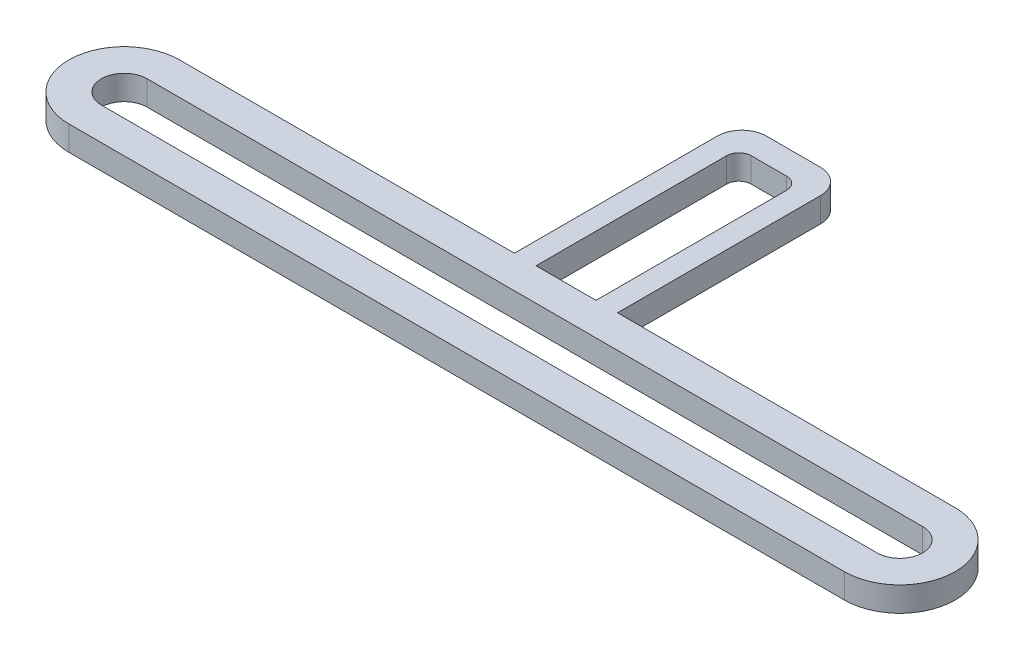
ISO-10303-21;
HEADER;
FILE_DESCRIPTION(('STEP AP214'),'2;1');
FILE_NAME('part.step','',(''),(''),'','','');
FILE_SCHEMA(('AUTOMOTIVE_DESIGN { 1 0 10303 214 1 1 1 1 }'));
ENDSEC;
DATA;
#1=APPLICATION_CONTEXT('core data for automotive mechanical design processes');
#2=APPLICATION_PROTOCOL_DEFINITION('international standard','automotive_design',2000,#1);
#3=PRODUCT_CONTEXT('',#1,'mechanical');
#4=PRODUCT('Part','Part','',(#3));
#5=PRODUCT_RELATED_PRODUCT_CATEGORY('part','',(#4));
#6=PRODUCT_DEFINITION_FORMATION('','',#4);
#7=PRODUCT_DEFINITION_CONTEXT('part definition',#1,'design');
#8=PRODUCT_DEFINITION('design','',#6,#7);
#9=PRODUCT_DEFINITION_SHAPE('','',#8);
#10=(LENGTH_UNIT() NAMED_UNIT(*) SI_UNIT(.MILLI.,.METRE.));
#11=(NAMED_UNIT(*) PLANE_ANGLE_UNIT() SI_UNIT($,.RADIAN.));
#12=(NAMED_UNIT(*) SI_UNIT($,.STERADIAN.) SOLID_ANGLE_UNIT());
#13=UNCERTAINTY_MEASURE_WITH_UNIT(LENGTH_MEASURE(1.E-05),#10,'distance_accuracy_value','');
#14=(GEOMETRIC_REPRESENTATION_CONTEXT(3) GLOBAL_UNCERTAINTY_ASSIGNED_CONTEXT((#13)) GLOBAL_UNIT_ASSIGNED_CONTEXT((#10,
#11,#12)) REPRESENTATION_CONTEXT('',''));
#15=CARTESIAN_POINT('',(0.,0.,0.));
#16=DIRECTION('',(0.,0.,1.));
#17=DIRECTION('',(1.,0.,0.));
#18=AXIS2_PLACEMENT_3D('',#15,#16,#17);
#19=CARTESIAN_POINT('',(-40.0346451989385,1.27,-0.00503280596550969));
#20=DIRECTION('',(0.,1.,0.));
#21=DIRECTION('',(0.,0.,1.));
#22=AXIS2_PLACEMENT_3D('',#19,#20,#21);
#23=PLANE('',#22);
#24=CARTESIAN_POINT('',(-40.0346451989385,1.27,-0.00503280596550969));
#25=DIRECTION('',(0.,1.,0.));
#26=DIRECTION('',(0.,0.,1.));
#27=AXIS2_PLACEMENT_3D('',#24,#25,#26);
#28=CIRCLE('',#27,5.7185550593657);
#29=CARTESIAN_POINT('',(-40.0346451989385,1.27,-5.72358786533121));
#30=VERTEX_POINT('',#29);
#31=CARTESIAN_POINT('',(-40.0346451989385,1.27,5.71352225340019));
#32=VERTEX_POINT('',#31);
#33=EDGE_CURVE('E387',#30,#32,#28,.T.);
#34=ORIENTED_EDGE('',*,*,#33,.T.);
#35=DIRECTION('',(1.,0.,0.));
#36=VECTOR('',#35,1.);
#37=CARTESIAN_POINT('',(-40.0346451989385,1.27,5.71352225340019));
#38=LINE('',#37,#36);
#39=CARTESIAN_POINT('',(40.0232445285439,1.27,5.71352225340019));
#40=VERTEX_POINT('',#39);
#41=EDGE_CURVE('E388',#32,#40,#38,.T.);
#42=ORIENTED_EDGE('',*,*,#41,.T.);
#43=CARTESIAN_POINT('',(40.0232445285439,1.27,-0.00503280596550969));
#44=DIRECTION('',(0.,1.,0.));
#45=DIRECTION('',(0.,0.,1.));
#46=AXIS2_PLACEMENT_3D('',#43,#44,#45);
#47=CIRCLE('',#46,5.7185550593657);
#48=CARTESIAN_POINT('',(40.0232445285439,1.27,-5.72358786533121));
#49=VERTEX_POINT('',#48);
#50=EDGE_CURVE('E395',#40,#49,#47,.T.);
#51=ORIENTED_EDGE('',*,*,#50,.T.);
#52=DIRECTION('',(1.,0.,0.));
#53=VECTOR('',#52,1.);
#54=CARTESIAN_POINT('',(5.17161553807814,1.27,-5.72358786533121));
#55=LINE('',#54,#53);
#56=CARTESIAN_POINT('',(5.17161553807814,1.27,-5.72358786533121));
#57=VERTEX_POINT('',#56);
#58=EDGE_CURVE('E396',#57,#49,#55,.T.);
#59=ORIENTED_EDGE('',*,*,#58,.F.);
#60=DIRECTION('',(0.,0.,-1.));
#61=VECTOR('',#60,1.);
#62=CARTESIAN_POINT('',(5.17161553807814,1.27,-5.72358786533121));
#63=LINE('',#62,#61);
#64=CARTESIAN_POINT('',(5.17161553807815,1.27,-26.6618558266479));
#65=VERTEX_POINT('',#64);
#66=EDGE_CURVE('E402',#57,#65,#63,.T.);
#67=ORIENTED_EDGE('',*,*,#66,.T.);
#68=CARTESIAN_POINT('',(2.63161553807814,1.27,-26.6618558266479));
#69=DIRECTION('',(0.,-1.,0.));
#70=DIRECTION('',(0.,0.,-1.));
#71=AXIS2_PLACEMENT_3D('',#68,#69,#70);
#72=CIRCLE('',#71,2.54000000000001);
#73=CARTESIAN_POINT('',(2.63161553807814,1.27,-29.201855826648));
#74=VERTEX_POINT('',#73);
#75=EDGE_CURVE('E404',#74,#65,#72,.T.);
#76=ORIENTED_EDGE('',*,*,#75,.F.);
#77=DIRECTION('',(1.,0.,0.));
#78=VECTOR('',#77,1.);
#79=CARTESIAN_POINT('',(-2.9368882764058,1.27,-29.201855826648));
#80=LINE('',#79,#78);
#81=CARTESIAN_POINT('',(-2.9368882764058,1.27,-29.201855826648));
#82=VERTEX_POINT('',#81);
#83=EDGE_CURVE('E407',#82,#74,#80,.T.);
#84=ORIENTED_EDGE('',*,*,#83,.F.);
#85=CARTESIAN_POINT('',(-2.9368882764058,1.27,-26.6618558266479));
#86=DIRECTION('',(0.,1.,0.));
#87=DIRECTION('',(0.,0.,1.));
#88=AXIS2_PLACEMENT_3D('',#85,#86,#87);
#89=CIRCLE('',#88,2.54000000000001);
#90=CARTESIAN_POINT('',(-5.47688827640581,1.27,-26.6618558266479));
#91=VERTEX_POINT('',#90);
#92=EDGE_CURVE('E411',#82,#91,#89,.T.);
#93=ORIENTED_EDGE('',*,*,#92,.T.);
#94=DIRECTION('',(0.,0.,-1.));
#95=VECTOR('',#94,1.);
#96=CARTESIAN_POINT('',(-5.47688827640581,1.27,-5.72358786533121));
#97=LINE('',#96,#95);
#98=CARTESIAN_POINT('',(-5.47688827640581,1.27,-5.72358786533121));
#99=VERTEX_POINT('',#98);
#100=EDGE_CURVE('E412',#99,#91,#97,.T.);
#101=ORIENTED_EDGE('',*,*,#100,.F.);
#102=DIRECTION('',(1.,0.,0.));
#103=VECTOR('',#102,1.);
#104=CARTESIAN_POINT('',(-40.0346451989385,1.27,-5.72358786533121));
#105=LINE('',#104,#103);
#106=EDGE_CURVE('E420',#30,#99,#105,.T.);
#107=ORIENTED_EDGE('',*,*,#106,.F.);
#108=EDGE_LOOP('',(#34,#42,#51,#59,#67,#76,#84,#93,#101,#107));
#109=FACE_BOUND('',#108,.T.);
#110=DIRECTION('',(0.,0.,-1.));
#111=VECTOR('',#110,1.);
#112=CARTESIAN_POINT('',(2.94644782536895,1.27,-5.72358786533121));
#113=LINE('',#112,#111);
#114=CARTESIAN_POINT('',(2.94644782536895,1.27,-5.72358786533121));
#115=VERTEX_POINT('',#114);
#116=CARTESIAN_POINT('',(2.94644782536895,1.27,-25.3918558266479));
#117=VERTEX_POINT('',#116);
#118=EDGE_CURVE('E323',#115,#117,#113,.T.);
#119=ORIENTED_EDGE('',*,*,#118,.F.);
#120=DIRECTION('',(1.,0.,0.));
#121=VECTOR('',#120,1.);
#122=CARTESIAN_POINT('',(-3.23867048751246,1.27,-5.72358786533121));
#123=LINE('',#122,#121);
#124=CARTESIAN_POINT('',(-3.23867048751246,1.27,-5.72358786533121));
#125=VERTEX_POINT('',#124);
#126=EDGE_CURVE('E319',#125,#115,#123,.T.);
#127=ORIENTED_EDGE('',*,*,#126,.F.);
#128=DIRECTION('',(0.,0.,-1.));
#129=VECTOR('',#128,1.);
#130=CARTESIAN_POINT('',(-3.23867048751246,1.27,-5.72358786533121));
#131=LINE('',#130,#129);
#132=CARTESIAN_POINT('',(-3.23867048751246,1.27,-25.3918558266479));
#133=VERTEX_POINT('',#132);
#134=EDGE_CURVE('E340',#125,#133,#131,.T.);
#135=ORIENTED_EDGE('',*,*,#134,.T.);
#136=CARTESIAN_POINT('',(-1.96867048751246,1.27,-25.3918558266479));
#137=DIRECTION('',(0.,1.,0.));
#138=DIRECTION('',(0.,0.,1.));
#139=AXIS2_PLACEMENT_3D('',#136,#137,#138);
#140=CIRCLE('',#139,1.27);
#141=CARTESIAN_POINT('',(-1.96867048751246,1.27,-26.6618558266479));
#142=VERTEX_POINT('',#141);
#143=EDGE_CURVE('E333',#142,#133,#140,.T.);
#144=ORIENTED_EDGE('',*,*,#143,.F.);
#145=DIRECTION('',(1.,0.,0.));
#146=VECTOR('',#145,1.);
#147=CARTESIAN_POINT('',(-1.96867048751246,1.27,-26.6618558266479));
#148=LINE('',#147,#146);
#149=CARTESIAN_POINT('',(1.67644782536895,1.27,-26.6618558266479));
#150=VERTEX_POINT('',#149);
#151=EDGE_CURVE('E332',#142,#150,#148,.T.);
#152=ORIENTED_EDGE('',*,*,#151,.T.);
#153=CARTESIAN_POINT('',(1.67644782536895,1.27,-25.3918558266479));
#154=DIRECTION('',(0.,-1.,0.));
#155=DIRECTION('',(0.,0.,-1.));
#156=AXIS2_PLACEMENT_3D('',#153,#154,#155);
#157=CIRCLE('',#156,1.27);
#158=EDGE_CURVE('E330',#150,#117,#157,.T.);
#159=ORIENTED_EDGE('',*,*,#158,.T.);
#160=EDGE_LOOP('',(#119,#127,#135,#144,#152,#159));
#161=FACE_BOUND('',#160,.T.);
#162=DIRECTION('',(1.,0.,0.));
#163=VECTOR('',#162,1.);
#164=CARTESIAN_POINT('',(-40.0346451989385,1.27,2.35261708693085));
#165=LINE('',#164,#163);
#166=CARTESIAN_POINT('',(-40.0346451989385,1.27,2.35261708693085));
#167=VERTEX_POINT('',#166);
#168=CARTESIAN_POINT('',(40.0232445285439,1.27,2.35261708693085));
#169=VERTEX_POINT('',#168);
#170=EDGE_CURVE('E284',#167,#169,#165,.T.);
#171=ORIENTED_EDGE('',*,*,#170,.F.);
#172=CARTESIAN_POINT('',(-40.0346451989385,1.27,-0.00503280596550969));
#173=DIRECTION('',(0.,1.,0.));
#174=DIRECTION('',(0.,0.,1.));
#175=AXIS2_PLACEMENT_3D('',#172,#173,#174);
#176=CIRCLE('',#175,2.35764989289636);
#177=CARTESIAN_POINT('',(-40.0346451989385,1.27,-2.36268269886187));
#178=VERTEX_POINT('',#177);
#179=EDGE_CURVE('E272',#178,#167,#176,.T.);
#180=ORIENTED_EDGE('',*,*,#179,.F.);
#181=DIRECTION('',(1.,0.,0.));
#182=VECTOR('',#181,1.);
#183=CARTESIAN_POINT('',(-40.0346451989385,1.27,-2.36268269886187));
#184=LINE('',#183,#182);
#185=CARTESIAN_POINT('',(40.0232445285439,1.27,-2.36268269886187));
#186=VERTEX_POINT('',#185);
#187=EDGE_CURVE('E300',#178,#186,#184,.T.);
#188=ORIENTED_EDGE('',*,*,#187,.T.);
#189=CARTESIAN_POINT('',(40.0232445285439,1.27,-0.00503280596550969));
#190=DIRECTION('',(0.,1.,0.));
#191=DIRECTION('',(0.,0.,1.));
#192=AXIS2_PLACEMENT_3D('',#189,#190,#191);
#193=CIRCLE('',#192,2.35764989289636);
#194=EDGE_CURVE('E293',#169,#186,#193,.T.);
#195=ORIENTED_EDGE('',*,*,#194,.F.);
#196=EDGE_LOOP('',(#171,#180,#188,#195));
#197=FACE_BOUND('',#196,.T.);
#198=ADVANCED_FACE('F131',(#109,#161,#197),#23,.T.);
#199=CARTESIAN_POINT('',(-40.0346451989385,-1.27,-0.00503280596550969));
#200=DIRECTION('',(0.,1.,0.));
#201=DIRECTION('',(0.,0.,1.));
#202=AXIS2_PLACEMENT_3D('',#199,#200,#201);
#203=PLANE('',#202);
#204=DIRECTION('',(1.,0.,0.));
#205=VECTOR('',#204,1.);
#206=CARTESIAN_POINT('',(-3.23867048751246,-1.27,-5.72358786533121));
#207=LINE('',#206,#205);
#208=CARTESIAN_POINT('',(-3.23867048751246,-1.27,-5.72358786533121));
#209=VERTEX_POINT('',#208);
#210=CARTESIAN_POINT('',(2.94644782536895,-1.27,-5.72358786533121));
#211=VERTEX_POINT('',#210);
#212=EDGE_CURVE('E292',#209,#211,#207,.T.);
#213=ORIENTED_EDGE('',*,*,#212,.T.);
#214=DIRECTION('',(0.,0.,-1.));
#215=VECTOR('',#214,1.);
#216=CARTESIAN_POINT('',(2.94644782536895,-1.27,-5.72358786533121));
#217=LINE('',#216,#215);
#218=CARTESIAN_POINT('',(2.94644782536895,-1.27,-25.3918558266479));
#219=VERTEX_POINT('',#218);
#220=EDGE_CURVE('E350',#211,#219,#217,.T.);
#221=ORIENTED_EDGE('',*,*,#220,.T.);
#222=CARTESIAN_POINT('',(1.67644782536895,-1.27,-25.3918558266479));
#223=DIRECTION('',(0.,-1.,0.));
#224=DIRECTION('',(0.,0.,-1.));
#225=AXIS2_PLACEMENT_3D('',#222,#223,#224);
#226=CIRCLE('',#225,1.27);
#227=CARTESIAN_POINT('',(1.67644782536895,-1.27,-26.6618558266479));
#228=VERTEX_POINT('',#227);
#229=EDGE_CURVE('E353',#228,#219,#226,.T.);
#230=ORIENTED_EDGE('',*,*,#229,.F.);
#231=DIRECTION('',(1.,0.,0.));
#232=VECTOR('',#231,1.);
#233=CARTESIAN_POINT('',(-1.96867048751246,-1.27,-26.6618558266479));
#234=LINE('',#233,#232);
#235=CARTESIAN_POINT('',(-1.96867048751246,-1.27,-26.6618558266479));
#236=VERTEX_POINT('',#235);
#237=EDGE_CURVE('E351',#236,#228,#234,.T.);
#238=ORIENTED_EDGE('',*,*,#237,.F.);
#239=CARTESIAN_POINT('',(-1.96867048751246,-1.27,-25.3918558266479));
#240=DIRECTION('',(0.,1.,0.));
#241=DIRECTION('',(0.,0.,1.));
#242=AXIS2_PLACEMENT_3D('',#239,#240,#241);
#243=CIRCLE('',#242,1.27);
#244=CARTESIAN_POINT('',(-3.23867048751246,-1.27,-25.3918558266479));
#245=VERTEX_POINT('',#244);
#246=EDGE_CURVE('E358',#236,#245,#243,.T.);
#247=ORIENTED_EDGE('',*,*,#246,.T.);
#248=DIRECTION('',(0.,0.,-1.));
#249=VECTOR('',#248,1.);
#250=CARTESIAN_POINT('',(-3.23867048751246,-1.27,-5.72358786533121));
#251=LINE('',#250,#249);
#252=EDGE_CURVE('E322',#209,#245,#251,.T.);
#253=ORIENTED_EDGE('',*,*,#252,.F.);
#254=EDGE_LOOP('',(#213,#221,#230,#238,#247,#253));
#255=FACE_BOUND('',#254,.T.);
#256=CARTESIAN_POINT('',(-40.0346451989385,-1.27,-0.00503280596550969));
#257=DIRECTION('',(0.,1.,0.));
#258=DIRECTION('',(0.,0.,1.));
#259=AXIS2_PLACEMENT_3D('',#256,#257,#258);
#260=CIRCLE('',#259,5.7185550593657);
#261=CARTESIAN_POINT('',(-40.0346451989385,-1.27,-5.72358786533121));
#262=VERTEX_POINT('',#261);
#263=CARTESIAN_POINT('',(-40.0346451989385,-1.27,5.71352225340019));
#264=VERTEX_POINT('',#263);
#265=EDGE_CURVE('E384',#262,#264,#260,.T.);
#266=ORIENTED_EDGE('',*,*,#265,.F.);
#267=DIRECTION('',(1.,0.,0.));
#268=VECTOR('',#267,1.);
#269=CARTESIAN_POINT('',(-40.0346451989385,-1.27,-5.72358786533121));
#270=LINE('',#269,#268);
#271=CARTESIAN_POINT('',(-5.47688827640581,-1.27,-5.72358786533121));
#272=VERTEX_POINT('',#271);
#273=EDGE_CURVE('E393',#262,#272,#270,.T.);
#274=ORIENTED_EDGE('',*,*,#273,.T.);
#275=DIRECTION('',(0.,0.,-1.));
#276=VECTOR('',#275,1.);
#277=CARTESIAN_POINT('',(-5.47688827640581,-1.27,-5.72358786533121));
#278=LINE('',#277,#276);
#279=CARTESIAN_POINT('',(-5.47688827640581,-1.27,-26.6618558266479));
#280=VERTEX_POINT('',#279);
#281=EDGE_CURVE('E453',#272,#280,#278,.T.);
#282=ORIENTED_EDGE('',*,*,#281,.T.);
#283=CARTESIAN_POINT('',(-2.9368882764058,-1.27,-26.6618558266479));
#284=DIRECTION('',(0.,1.,0.));
#285=DIRECTION('',(0.,0.,1.));
#286=AXIS2_PLACEMENT_3D('',#283,#284,#285);
#287=CIRCLE('',#286,2.54000000000001);
#288=CARTESIAN_POINT('',(-2.9368882764058,-1.27,-29.201855826648));
#289=VERTEX_POINT('',#288);
#290=EDGE_CURVE('E446',#289,#280,#287,.T.);
#291=ORIENTED_EDGE('',*,*,#290,.F.);
#292=DIRECTION('',(1.,0.,0.));
#293=VECTOR('',#292,1.);
#294=CARTESIAN_POINT('',(-2.9368882764058,-1.27,-29.201855826648));
#295=LINE('',#294,#293);
#296=CARTESIAN_POINT('',(2.63161553807814,-1.27,-29.201855826648));
#297=VERTEX_POINT('',#296);
#298=EDGE_CURVE('E448',#289,#297,#295,.T.);
#299=ORIENTED_EDGE('',*,*,#298,.T.);
#300=CARTESIAN_POINT('',(2.63161553807814,-1.27,-26.6618558266479));
#301=DIRECTION('',(0.,-1.,0.));
#302=DIRECTION('',(0.,0.,-1.));
#303=AXIS2_PLACEMENT_3D('',#300,#301,#302);
#304=CIRCLE('',#303,2.54000000000001);
#305=CARTESIAN_POINT('',(5.17161553807815,-1.27,-26.6618558266479));
#306=VERTEX_POINT('',#305);
#307=EDGE_CURVE('E445',#297,#306,#304,.T.);
#308=ORIENTED_EDGE('',*,*,#307,.T.);
#309=DIRECTION('',(0.,0.,-1.));
#310=VECTOR('',#309,1.);
#311=CARTESIAN_POINT('',(5.17161553807814,-1.27,-5.72358786533121));
#312=LINE('',#311,#310);
#313=CARTESIAN_POINT('',(5.17161553807814,-1.27,-5.72358786533121));
#314=VERTEX_POINT('',#313);
#315=EDGE_CURVE('E437',#314,#306,#312,.T.);
#316=ORIENTED_EDGE('',*,*,#315,.F.);
#317=DIRECTION('',(1.,0.,0.));
#318=VECTOR('',#317,1.);
#319=CARTESIAN_POINT('',(5.17161553807814,-1.27,-5.72358786533121));
#320=LINE('',#319,#318);
#321=CARTESIAN_POINT('',(40.0232445285439,-1.27,-5.72358786533121));
#322=VERTEX_POINT('',#321);
#323=EDGE_CURVE('E432',#314,#322,#320,.T.);
#324=ORIENTED_EDGE('',*,*,#323,.T.);
#325=CARTESIAN_POINT('',(40.0232445285439,-1.27,-0.00503280596550969));
#326=DIRECTION('',(0.,1.,0.));
#327=DIRECTION('',(0.,0.,1.));
#328=AXIS2_PLACEMENT_3D('',#325,#326,#327);
#329=CIRCLE('',#328,5.7185550593657);
#330=CARTESIAN_POINT('',(40.0232445285439,-1.27,5.71352225340019));
#331=VERTEX_POINT('',#330);
#332=EDGE_CURVE('E429',#331,#322,#329,.T.);
#333=ORIENTED_EDGE('',*,*,#332,.F.);
#334=DIRECTION('',(1.,0.,0.));
#335=VECTOR('',#334,1.);
#336=CARTESIAN_POINT('',(-40.0346451989385,-1.27,5.71352225340019));
#337=LINE('',#336,#335);
#338=EDGE_CURVE('E430',#264,#331,#337,.T.);
#339=ORIENTED_EDGE('',*,*,#338,.F.);
#340=EDGE_LOOP('',(#266,#274,#282,#291,#299,#308,#316,#324,#333,#339));
#341=FACE_BOUND('',#340,.T.);
#342=CARTESIAN_POINT('',(-40.0346451989385,-1.27,-0.00503280596550969));
#343=DIRECTION('',(0.,1.,0.));
#344=DIRECTION('',(0.,0.,1.));
#345=AXIS2_PLACEMENT_3D('',#342,#343,#344);
#346=CIRCLE('',#345,2.35764989289636);
#347=CARTESIAN_POINT('',(-40.0346451989385,-1.27,-2.36268269886187));
#348=VERTEX_POINT('',#347);
#349=CARTESIAN_POINT('',(-40.0346451989385,-1.27,2.35261708693085));
#350=VERTEX_POINT('',#349);
#351=EDGE_CURVE('E157',#348,#350,#346,.T.);
#352=ORIENTED_EDGE('',*,*,#351,.T.);
#353=DIRECTION('',(1.,0.,0.));
#354=VECTOR('',#353,1.);
#355=CARTESIAN_POINT('',(-40.0346451989385,-1.27,2.35261708693085));
#356=LINE('',#355,#354);
#357=CARTESIAN_POINT('',(40.0232445285439,-1.27,2.35261708693085));
#358=VERTEX_POINT('',#357);
#359=EDGE_CURVE('E288',#350,#358,#356,.T.);
#360=ORIENTED_EDGE('',*,*,#359,.T.);
#361=CARTESIAN_POINT('',(40.0232445285439,-1.27,-0.00503280596550969));
#362=DIRECTION('',(0.,1.,0.));
#363=DIRECTION('',(0.,0.,1.));
#364=AXIS2_PLACEMENT_3D('',#361,#362,#363);
#365=CIRCLE('',#364,2.35764989289636);
#366=CARTESIAN_POINT('',(40.0232445285439,-1.27,-2.36268269886187));
#367=VERTEX_POINT('',#366);
#368=EDGE_CURVE('E306',#358,#367,#365,.T.);
#369=ORIENTED_EDGE('',*,*,#368,.T.);
#370=DIRECTION('',(1.,0.,0.));
#371=VECTOR('',#370,1.);
#372=CARTESIAN_POINT('',(-40.0346451989385,-1.27,-2.36268269886187));
#373=LINE('',#372,#371);
#374=EDGE_CURVE('E282',#348,#367,#373,.T.);
#375=ORIENTED_EDGE('',*,*,#374,.F.);
#376=EDGE_LOOP('',(#352,#360,#369,#375));
#377=FACE_BOUND('',#376,.T.);
#378=ADVANCED_FACE('F493',(#255,#341,#377),#203,.F.);
#379=CARTESIAN_POINT('',(-40.0346451989385,1.27,-0.00503280596550969));
#380=DIRECTION('',(0.,-1.,0.));
#381=DIRECTION('',(0.,0.,-1.));
#382=AXIS2_PLACEMENT_3D('',#379,#380,#381);
#383=CYLINDRICAL_SURFACE('',#382,5.7185550593657);
#384=ORIENTED_EDGE('',*,*,#265,.T.);
#385=DIRECTION('',(0.,-1.,0.));
#386=VECTOR('',#385,1.);
#387=CARTESIAN_POINT('',(-40.0346451989385,1.27,5.71352225340019));
#388=LINE('',#387,#386);
#389=EDGE_CURVE('E12',#32,#264,#388,.T.);
#390=ORIENTED_EDGE('',*,*,#389,.F.);
#391=ORIENTED_EDGE('',*,*,#33,.F.);
#392=DIRECTION('',(0.,-1.,0.));
#393=VECTOR('',#392,1.);
#394=CARTESIAN_POINT('',(-40.0346451989385,1.27,-5.72358786533121));
#395=LINE('',#394,#393);
#396=EDGE_CURVE('E421',#30,#262,#395,.T.);
#397=ORIENTED_EDGE('',*,*,#396,.T.);
#398=EDGE_LOOP('',(#384,#390,#391,#397));
#399=FACE_BOUND('',#398,.T.);
#400=ADVANCED_FACE('F136',(#399),#383,.T.);
#401=CARTESIAN_POINT('',(-40.0346451989385,1.27,5.71352225340019));
#402=DIRECTION('',(0.,0.,-1.));
#403=DIRECTION('',(-1.,0.,0.));
#404=AXIS2_PLACEMENT_3D('',#401,#402,#403);
#405=PLANE('',#404);
#406=ORIENTED_EDGE('',*,*,#338,.T.);
#407=DIRECTION('',(0.,-1.,0.));
#408=VECTOR('',#407,1.);
#409=CARTESIAN_POINT('',(40.0232445285439,1.27,5.71352225340019));
#410=LINE('',#409,#408);
#411=EDGE_CURVE('E145',#40,#331,#410,.T.);
#412=ORIENTED_EDGE('',*,*,#411,.F.);
#413=ORIENTED_EDGE('',*,*,#41,.F.);
#414=ORIENTED_EDGE('',*,*,#389,.T.);
#415=EDGE_LOOP('',(#406,#412,#413,#414));
#416=FACE_BOUND('',#415,.T.);
#417=ADVANCED_FACE('F508',(#416),#405,.F.);
#418=CARTESIAN_POINT('',(40.0232445285439,1.27,-0.00503280596550969));
#419=DIRECTION('',(0.,-1.,0.));
#420=DIRECTION('',(0.,0.,-1.));
#421=AXIS2_PLACEMENT_3D('',#418,#419,#420);
#422=CYLINDRICAL_SURFACE('',#421,5.7185550593657);
#423=ORIENTED_EDGE('',*,*,#332,.T.);
#424=DIRECTION('',(0.,-1.,0.));
#425=VECTOR('',#424,1.);
#426=CARTESIAN_POINT('',(40.0232445285439,1.27,-5.72358786533121));
#427=LINE('',#426,#425);
#428=EDGE_CURVE('E481',#49,#322,#427,.T.);
#429=ORIENTED_EDGE('',*,*,#428,.F.);
#430=ORIENTED_EDGE('',*,*,#50,.F.);
#431=ORIENTED_EDGE('',*,*,#411,.T.);
#432=EDGE_LOOP('',(#423,#429,#430,#431));
#433=FACE_BOUND('',#432,.T.);
#434=ADVANCED_FACE('F487',(#433),#422,.T.);
#435=CARTESIAN_POINT('',(5.17161553807814,1.27,-5.72358786533121));
#436=DIRECTION('',(0.,0.,-1.));
#437=DIRECTION('',(-1.,0.,0.));
#438=AXIS2_PLACEMENT_3D('',#435,#436,#437);
#439=PLANE('',#438);
#440=ORIENTED_EDGE('',*,*,#323,.F.);
#441=DIRECTION('',(0.,-1.,0.));
#442=VECTOR('',#441,1.);
#443=CARTESIAN_POINT('',(5.17161553807814,1.27,-5.72358786533121));
#444=LINE('',#443,#442);
#445=EDGE_CURVE('E476',#57,#314,#444,.T.);
#446=ORIENTED_EDGE('',*,*,#445,.F.);
#447=ORIENTED_EDGE('',*,*,#58,.T.);
#448=ORIENTED_EDGE('',*,*,#428,.T.);
#449=EDGE_LOOP('',(#440,#446,#447,#448));
#450=FACE_BOUND('',#449,.T.);
#451=ADVANCED_FACE('F496',(#450),#439,.T.);
#452=CARTESIAN_POINT('',(5.17161553807814,1.27,-5.72358786533121));
#453=DIRECTION('',(-1.,0.,0.));
#454=DIRECTION('',(0.,0.,1.));
#455=AXIS2_PLACEMENT_3D('',#452,#453,#454);
#456=PLANE('',#455);
#457=ORIENTED_EDGE('',*,*,#315,.T.);
#458=DIRECTION('',(0.,-1.,0.));
#459=VECTOR('',#458,1.);
#460=CARTESIAN_POINT('',(5.17161553807815,1.27,-26.6618558266479));
#461=LINE('',#460,#459);
#462=EDGE_CURVE('E474',#65,#306,#461,.T.);
#463=ORIENTED_EDGE('',*,*,#462,.F.);
#464=ORIENTED_EDGE('',*,*,#66,.F.);
#465=ORIENTED_EDGE('',*,*,#445,.T.);
#466=EDGE_LOOP('',(#457,#463,#464,#465));
#467=FACE_BOUND('',#466,.T.);
#468=ADVANCED_FACE('F529',(#467),#456,.F.);
#469=CARTESIAN_POINT('',(2.63161553807814,1.27,-26.6618558266479));
#470=DIRECTION('',(0.,-1.,0.));
#471=DIRECTION('',(0.,0.,-1.));
#472=AXIS2_PLACEMENT_3D('',#469,#470,#471);
#473=CYLINDRICAL_SURFACE('',#472,2.54000000000001);
#474=ORIENTED_EDGE('',*,*,#307,.F.);
#475=DIRECTION('',(0.,-1.,0.));
#476=VECTOR('',#475,1.);
#477=CARTESIAN_POINT('',(2.63161553807814,1.27,-29.201855826648));
#478=LINE('',#477,#476);
#479=EDGE_CURVE('E472',#74,#297,#478,.T.);
#480=ORIENTED_EDGE('',*,*,#479,.F.);
#481=ORIENTED_EDGE('',*,*,#75,.T.);
#482=ORIENTED_EDGE('',*,*,#462,.T.);
#483=EDGE_LOOP('',(#474,#480,#481,#482));
#484=FACE_BOUND('',#483,.T.);
#485=ADVANCED_FACE('F526',(#484),#473,.T.);
#486=CARTESIAN_POINT('',(-2.9368882764058,1.27,-29.201855826648));
#487=DIRECTION('',(0.,0.,-1.));
#488=DIRECTION('',(-1.,0.,0.));
#489=AXIS2_PLACEMENT_3D('',#486,#487,#488);
#490=PLANE('',#489);
#491=ORIENTED_EDGE('',*,*,#298,.F.);
#492=DIRECTION('',(0.,-1.,0.));
#493=VECTOR('',#492,1.);
#494=CARTESIAN_POINT('',(-2.9368882764058,1.27,-29.201855826648));
#495=LINE('',#494,#493);
#496=EDGE_CURVE('E468',#82,#289,#495,.T.);
#497=ORIENTED_EDGE('',*,*,#496,.F.);
#498=ORIENTED_EDGE('',*,*,#83,.T.);
#499=ORIENTED_EDGE('',*,*,#479,.T.);
#500=EDGE_LOOP('',(#491,#497,#498,#499));
#501=FACE_BOUND('',#500,.T.);
#502=ADVANCED_FACE('F525',(#501),#490,.T.);
#503=CARTESIAN_POINT('',(-2.9368882764058,1.27,-26.6618558266479));
#504=DIRECTION('',(0.,-1.,0.));
#505=DIRECTION('',(0.,0.,-1.));
#506=AXIS2_PLACEMENT_3D('',#503,#504,#505);
#507=CYLINDRICAL_SURFACE('',#506,2.54000000000001);
#508=ORIENTED_EDGE('',*,*,#290,.T.);
#509=DIRECTION('',(0.,-1.,0.));
#510=VECTOR('',#509,1.);
#511=CARTESIAN_POINT('',(-5.47688827640581,1.27,-26.6618558266479));
#512=LINE('',#511,#510);
#513=EDGE_CURVE('E469',#91,#280,#512,.T.);
#514=ORIENTED_EDGE('',*,*,#513,.F.);
#515=ORIENTED_EDGE('',*,*,#92,.F.);
#516=ORIENTED_EDGE('',*,*,#496,.T.);
#517=EDGE_LOOP('',(#508,#514,#515,#516));
#518=FACE_BOUND('',#517,.T.);
#519=ADVANCED_FACE('F551',(#518),#507,.T.);
#520=CARTESIAN_POINT('',(-5.47688827640581,1.27,-5.72358786533121));
#521=DIRECTION('',(-1.,0.,0.));
#522=DIRECTION('',(0.,0.,1.));
#523=AXIS2_PLACEMENT_3D('',#520,#521,#522);
#524=PLANE('',#523);
#525=ORIENTED_EDGE('',*,*,#281,.F.);
#526=DIRECTION('',(0.,-1.,0.));
#527=VECTOR('',#526,1.);
#528=CARTESIAN_POINT('',(-5.47688827640581,1.27,-5.72358786533121));
#529=LINE('',#528,#527);
#530=EDGE_CURVE('E462',#99,#272,#529,.T.);
#531=ORIENTED_EDGE('',*,*,#530,.F.);
#532=ORIENTED_EDGE('',*,*,#100,.T.);
#533=ORIENTED_EDGE('',*,*,#513,.T.);
#534=EDGE_LOOP('',(#525,#531,#532,#533));
#535=FACE_BOUND('',#534,.T.);
#536=ADVANCED_FACE('F519',(#535),#524,.T.);
#537=CARTESIAN_POINT('',(-40.0346451989385,1.27,-5.72358786533121));
#538=DIRECTION('',(0.,0.,-1.));
#539=DIRECTION('',(-1.,0.,0.));
#540=AXIS2_PLACEMENT_3D('',#537,#538,#539);
#541=PLANE('',#540);
#542=ORIENTED_EDGE('',*,*,#273,.F.);
#543=ORIENTED_EDGE('',*,*,#396,.F.);
#544=ORIENTED_EDGE('',*,*,#106,.T.);
#545=ORIENTED_EDGE('',*,*,#530,.T.);
#546=EDGE_LOOP('',(#542,#543,#544,#545));
#547=FACE_BOUND('',#546,.T.);
#548=ADVANCED_FACE('F511',(#547),#541,.T.);
#549=CARTESIAN_POINT('',(-3.23867048751246,1.27,-5.72358786533121));
#550=DIRECTION('',(0.,0.,-1.));
#551=DIRECTION('',(-1.,0.,0.));
#552=AXIS2_PLACEMENT_3D('',#549,#550,#551);
#553=PLANE('',#552);
#554=ORIENTED_EDGE('',*,*,#212,.F.);
#555=DIRECTION('',(0.,-1.,0.));
#556=VECTOR('',#555,1.);
#557=CARTESIAN_POINT('',(-3.23867048751246,1.27,-5.72358786533121));
#558=LINE('',#557,#556);
#559=EDGE_CURVE('E345',#125,#209,#558,.T.);
#560=ORIENTED_EDGE('',*,*,#559,.F.);
#561=ORIENTED_EDGE('',*,*,#126,.T.);
#562=DIRECTION('',(0.,-1.,0.));
#563=VECTOR('',#562,1.);
#564=CARTESIAN_POINT('',(2.94644782536895,1.27,-5.72358786533121));
#565=LINE('',#564,#563);
#566=EDGE_CURVE('E381',#115,#211,#565,.T.);
#567=ORIENTED_EDGE('',*,*,#566,.T.);
#568=EDGE_LOOP('',(#554,#560,#561,#567));
#569=FACE_BOUND('',#568,.T.);
#570=ADVANCED_FACE('F550',(#569),#553,.T.);
#571=CARTESIAN_POINT('',(2.94644782536895,1.27,-5.72358786533121));
#572=DIRECTION('',(-1.,0.,0.));
#573=DIRECTION('',(0.,0.,1.));
#574=AXIS2_PLACEMENT_3D('',#571,#572,#573);
#575=PLANE('',#574);
#576=ORIENTED_EDGE('',*,*,#220,.F.);
#577=ORIENTED_EDGE('',*,*,#566,.F.);
#578=ORIENTED_EDGE('',*,*,#118,.T.);
#579=DIRECTION('',(0.,-1.,0.));
#580=VECTOR('',#579,1.);
#581=CARTESIAN_POINT('',(2.94644782536895,1.27,-25.3918558266479));
#582=LINE('',#581,#580);
#583=EDGE_CURVE('E378',#117,#219,#582,.T.);
#584=ORIENTED_EDGE('',*,*,#583,.T.);
#585=EDGE_LOOP('',(#576,#577,#578,#584));
#586=FACE_BOUND('',#585,.T.);
#587=ADVANCED_FACE('F585',(#586),#575,.T.);
#588=CARTESIAN_POINT('',(1.67644782536895,1.27,-25.3918558266479));
#589=DIRECTION('',(0.,-1.,0.));
#590=DIRECTION('',(0.,0.,-1.));
#591=AXIS2_PLACEMENT_3D('',#588,#589,#590);
#592=CYLINDRICAL_SURFACE('',#591,1.27);
#593=ORIENTED_EDGE('',*,*,#229,.T.);
#594=ORIENTED_EDGE('',*,*,#583,.F.);
#595=ORIENTED_EDGE('',*,*,#158,.F.);
#596=DIRECTION('',(0.,-1.,0.));
#597=VECTOR('',#596,1.);
#598=CARTESIAN_POINT('',(1.67644782536895,1.27,-26.6618558266479));
#599=LINE('',#598,#597);
#600=EDGE_CURVE('E374',#150,#228,#599,.T.);
#601=ORIENTED_EDGE('',*,*,#600,.T.);
#602=EDGE_LOOP('',(#593,#594,#595,#601));
#603=FACE_BOUND('',#602,.T.);
#604=ADVANCED_FACE('F595',(#603),#592,.F.);
#605=CARTESIAN_POINT('',(-1.96867048751246,1.27,-26.6618558266479));
#606=DIRECTION('',(0.,0.,-1.));
#607=DIRECTION('',(-1.,0.,0.));
#608=AXIS2_PLACEMENT_3D('',#605,#606,#607);
#609=PLANE('',#608);
#610=ORIENTED_EDGE('',*,*,#237,.T.);
#611=ORIENTED_EDGE('',*,*,#600,.F.);
#612=ORIENTED_EDGE('',*,*,#151,.F.);
#613=DIRECTION('',(0.,-1.,0.));
#614=VECTOR('',#613,1.);
#615=CARTESIAN_POINT('',(-1.96867048751246,1.27,-26.6618558266479));
#616=LINE('',#615,#614);
#617=EDGE_CURVE('E375',#142,#236,#616,.T.);
#618=ORIENTED_EDGE('',*,*,#617,.T.);
#619=EDGE_LOOP('',(#610,#611,#612,#618));
#620=FACE_BOUND('',#619,.T.);
#621=ADVANCED_FACE('F599',(#620),#609,.F.);
#622=CARTESIAN_POINT('',(-1.96867048751246,1.27,-25.3918558266479));
#623=DIRECTION('',(0.,-1.,0.));
#624=DIRECTION('',(0.,0.,-1.));
#625=AXIS2_PLACEMENT_3D('',#622,#623,#624);
#626=CYLINDRICAL_SURFACE('',#625,1.27);
#627=ORIENTED_EDGE('',*,*,#246,.F.);
#628=ORIENTED_EDGE('',*,*,#617,.F.);
#629=ORIENTED_EDGE('',*,*,#143,.T.);
#630=DIRECTION('',(0.,-1.,0.));
#631=VECTOR('',#630,1.);
#632=CARTESIAN_POINT('',(-3.23867048751246,1.27,-25.3918558266479));
#633=LINE('',#632,#631);
#634=EDGE_CURVE('E369',#133,#245,#633,.T.);
#635=ORIENTED_EDGE('',*,*,#634,.T.);
#636=EDGE_LOOP('',(#627,#628,#629,#635));
#637=FACE_BOUND('',#636,.T.);
#638=ADVANCED_FACE('F606',(#637),#626,.F.);
#639=CARTESIAN_POINT('',(-3.23867048751246,1.27,-5.72358786533121));
#640=DIRECTION('',(-1.,0.,0.));
#641=DIRECTION('',(0.,0.,1.));
#642=AXIS2_PLACEMENT_3D('',#639,#640,#641);
#643=PLANE('',#642);
#644=ORIENTED_EDGE('',*,*,#252,.T.);
#645=ORIENTED_EDGE('',*,*,#634,.F.);
#646=ORIENTED_EDGE('',*,*,#134,.F.);
#647=ORIENTED_EDGE('',*,*,#559,.T.);
#648=EDGE_LOOP('',(#644,#645,#646,#647));
#649=FACE_BOUND('',#648,.T.);
#650=ADVANCED_FACE('F620',(#649),#643,.F.);
#651=CARTESIAN_POINT('',(-40.0346451989385,1.27,-0.00503280596550969));
#652=DIRECTION('',(0.,-1.,0.));
#653=DIRECTION('',(0.,0.,-1.));
#654=AXIS2_PLACEMENT_3D('',#651,#652,#653);
#655=CYLINDRICAL_SURFACE('',#654,2.35764989289636);
#656=ORIENTED_EDGE('',*,*,#351,.F.);
#657=DIRECTION('',(0.,-1.,0.));
#658=VECTOR('',#657,1.);
#659=CARTESIAN_POINT('',(-40.0346451989385,1.27,-2.36268269886187));
#660=LINE('',#659,#658);
#661=EDGE_CURVE('E280',#178,#348,#660,.T.);
#662=ORIENTED_EDGE('',*,*,#661,.F.);
#663=ORIENTED_EDGE('',*,*,#179,.T.);
#664=DIRECTION('',(0.,-1.,0.));
#665=VECTOR('',#664,1.);
#666=CARTESIAN_POINT('',(-40.0346451989385,1.27,2.35261708693085));
#667=LINE('',#666,#665);
#668=EDGE_CURVE('E277',#167,#350,#667,.T.);
#669=ORIENTED_EDGE('',*,*,#668,.T.);
#670=EDGE_LOOP('',(#656,#662,#663,#669));
#671=FACE_BOUND('',#670,.T.);
#672=ADVANCED_FACE('F274',(#671),#655,.F.);
#673=CARTESIAN_POINT('',(-40.0346451989385,1.27,2.35261708693085));
#674=DIRECTION('',(0.,0.,-1.));
#675=DIRECTION('',(-1.,0.,0.));
#676=AXIS2_PLACEMENT_3D('',#673,#674,#675);
#677=PLANE('',#676);
#678=ORIENTED_EDGE('',*,*,#359,.F.);
#679=ORIENTED_EDGE('',*,*,#668,.F.);
#680=ORIENTED_EDGE('',*,*,#170,.T.);
#681=DIRECTION('',(0.,-1.,0.));
#682=VECTOR('',#681,1.);
#683=CARTESIAN_POINT('',(40.0232445285439,1.27,2.35261708693085));
#684=LINE('',#683,#682);
#685=EDGE_CURVE('E295',#169,#358,#684,.T.);
#686=ORIENTED_EDGE('',*,*,#685,.T.);
#687=EDGE_LOOP('',(#678,#679,#680,#686));
#688=FACE_BOUND('',#687,.T.);
#689=ADVANCED_FACE('F289',(#688),#677,.T.);
#690=CARTESIAN_POINT('',(40.0232445285439,1.27,-0.00503280596550969));
#691=DIRECTION('',(0.,-1.,0.));
#692=DIRECTION('',(0.,0.,-1.));
#693=AXIS2_PLACEMENT_3D('',#690,#691,#692);
#694=CYLINDRICAL_SURFACE('',#693,2.35764989289636);
#695=ORIENTED_EDGE('',*,*,#368,.F.);
#696=ORIENTED_EDGE('',*,*,#685,.F.);
#697=ORIENTED_EDGE('',*,*,#194,.T.);
#698=DIRECTION('',(0.,-1.,0.));
#699=VECTOR('',#698,1.);
#700=CARTESIAN_POINT('',(40.0232445285439,1.27,-2.36268269886187));
#701=LINE('',#700,#699);
#702=EDGE_CURVE('E151',#186,#367,#701,.T.);
#703=ORIENTED_EDGE('',*,*,#702,.T.);
#704=EDGE_LOOP('',(#695,#696,#697,#703));
#705=FACE_BOUND('',#704,.T.);
#706=ADVANCED_FACE('F645',(#705),#694,.F.);
#707=CARTESIAN_POINT('',(-40.0346451989385,1.27,-2.36268269886187));
#708=DIRECTION('',(0.,0.,-1.));
#709=DIRECTION('',(-1.,0.,0.));
#710=AXIS2_PLACEMENT_3D('',#707,#708,#709);
#711=PLANE('',#710);
#712=ORIENTED_EDGE('',*,*,#374,.T.);
#713=ORIENTED_EDGE('',*,*,#702,.F.);
#714=ORIENTED_EDGE('',*,*,#187,.F.);
#715=ORIENTED_EDGE('',*,*,#661,.T.);
#716=EDGE_LOOP('',(#712,#713,#714,#715));
#717=FACE_BOUND('',#716,.T.);
#718=ADVANCED_FACE('F649',(#717),#711,.F.);
#719=CLOSED_SHELL('',(#198,#378,#400,#417,#434,#451,#468,#485,#502,#519,#536,#548,#570,#587,
#604,#621,#638,#650,#672,#689,#706,#718));
#720=MANIFOLD_SOLID_BREP('B2',#719);
#721=ADVANCED_BREP_SHAPE_REPRESENTATION('',(#18,#720),#14);
#722=SHAPE_DEFINITION_REPRESENTATION(#9,#721);
ENDSEC;
END-ISO-10303-21;
